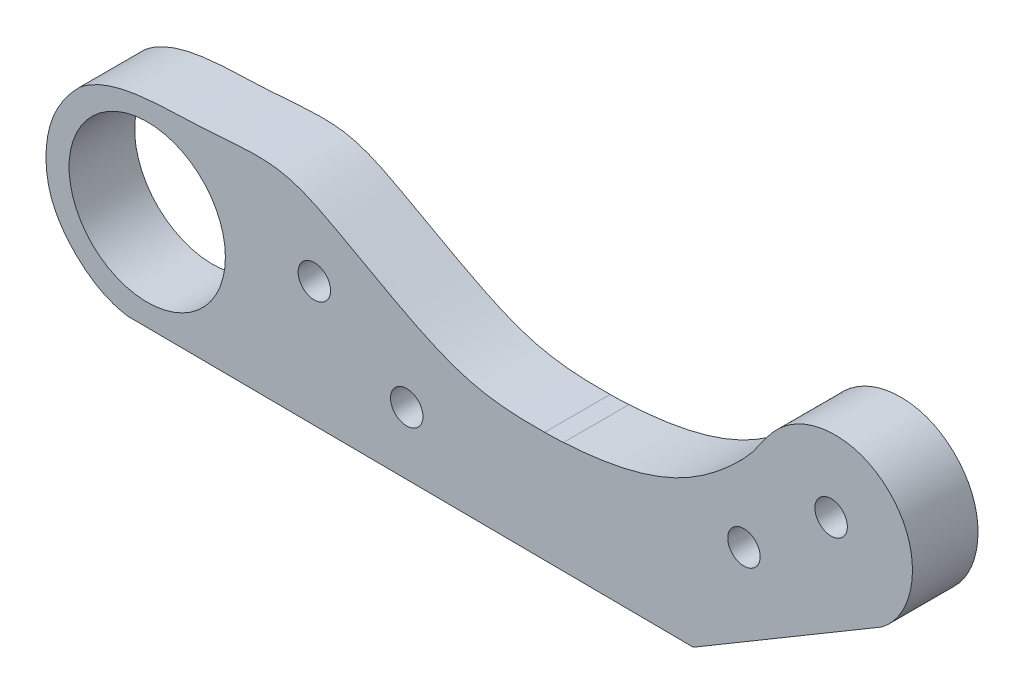
ISO-10303-21;
HEADER;
FILE_DESCRIPTION(('STEP AP214'),'2;1');
FILE_NAME('part.step','',(''),(''),'','','');
FILE_SCHEMA(('AUTOMOTIVE_DESIGN { 1 0 10303 214 1 1 1 1 }'));
ENDSEC;
DATA;
#1=APPLICATION_CONTEXT('core data for automotive mechanical design processes');
#2=APPLICATION_PROTOCOL_DEFINITION('international standard','automotive_design',2000,#1);
#3=PRODUCT_CONTEXT('',#1,'mechanical');
#4=PRODUCT('Part','Part','',(#3));
#5=PRODUCT_RELATED_PRODUCT_CATEGORY('part','',(#4));
#6=PRODUCT_DEFINITION_FORMATION('','',#4);
#7=PRODUCT_DEFINITION_CONTEXT('part definition',#1,'design');
#8=PRODUCT_DEFINITION('design','',#6,#7);
#9=PRODUCT_DEFINITION_SHAPE('','',#8);
#10=(LENGTH_UNIT() NAMED_UNIT(*) SI_UNIT(.MILLI.,.METRE.));
#11=(NAMED_UNIT(*) PLANE_ANGLE_UNIT() SI_UNIT($,.RADIAN.));
#12=(NAMED_UNIT(*) SI_UNIT($,.STERADIAN.) SOLID_ANGLE_UNIT());
#13=UNCERTAINTY_MEASURE_WITH_UNIT(LENGTH_MEASURE(1.E-05),#10,'distance_accuracy_value','');
#14=(GEOMETRIC_REPRESENTATION_CONTEXT(3) GLOBAL_UNCERTAINTY_ASSIGNED_CONTEXT((#13)) GLOBAL_UNIT_ASSIGNED_CONTEXT((#10,
#11,#12)) REPRESENTATION_CONTEXT('',''));
#15=CARTESIAN_POINT('',(0.,0.,0.));
#16=DIRECTION('',(0.,0.,1.));
#17=DIRECTION('',(1.,0.,0.));
#18=AXIS2_PLACEMENT_3D('',#15,#16,#17);
#19=CARTESIAN_POINT('',(-16.3651324524654,27.597237205665,5.05));
#20=DIRECTION('',(-0.510061044769221,0.860138204365398,0.));
#21=DIRECTION('',(-0.860138204365398,-0.510061044769221,0.));
#22=AXIS2_PLACEMENT_3D('',#19,#20,#21);
#23=PLANE('',#22);
#24=DIRECTION('',(0.860138204365398,0.510061044769221,0.));
#25=VECTOR('',#24,1.);
#26=CARTESIAN_POINT('',(-16.3651324524654,27.597237205665,0.));
#27=LINE('',#26,#25);
#28=CARTESIAN_POINT('',(-45.8065173750898,10.1385271089941,0.));
#29=VERTEX_POINT('',#28);
#30=CARTESIAN_POINT('',(-31.2793439312161,18.7531255848201,0.));
#31=VERTEX_POINT('',#30);
#32=EDGE_CURVE('E197',#29,#31,#27,.T.);
#33=ORIENTED_EDGE('',*,*,#32,.T.);
#34=DIRECTION('',(0.,0.,-1.));
#35=VECTOR('',#34,1.);
#36=CARTESIAN_POINT('',(-31.2793439312161,18.7531255848201,5.05));
#37=LINE('',#36,#35);
#38=CARTESIAN_POINT('',(-31.2793439312161,18.7531255848201,5.05));
#39=VERTEX_POINT('',#38);
#40=EDGE_CURVE('E11',#39,#31,#37,.T.);
#41=ORIENTED_EDGE('',*,*,#40,.F.);
#42=DIRECTION('',(0.860138204365398,0.510061044769221,0.));
#43=VECTOR('',#42,1.);
#44=CARTESIAN_POINT('',(-16.3651324524654,27.597237205665,5.05));
#45=LINE('',#44,#43);
#46=CARTESIAN_POINT('',(-45.8065173750898,10.1385271089941,5.05));
#47=VERTEX_POINT('',#46);
#48=EDGE_CURVE('E144',#47,#39,#45,.T.);
#49=ORIENTED_EDGE('',*,*,#48,.F.);
#50=DIRECTION('',(0.,0.,-1.));
#51=VECTOR('',#50,1.);
#52=CARTESIAN_POINT('',(-45.8065173750898,10.1385271089941,5.05));
#53=LINE('',#52,#51);
#54=EDGE_CURVE('E119',#47,#29,#53,.T.);
#55=ORIENTED_EDGE('',*,*,#54,.T.);
#56=EDGE_LOOP('',(#33,#41,#49,#55));
#57=FACE_BOUND('',#56,.T.);
#58=ADVANCED_FACE('F38',(#57),#23,.F.);
#59=CARTESIAN_POINT('',(-31.2793439312161,18.7531255848201,5.05));
#60=CARTESIAN_POINT('',(-29.0980433454653,20.4036510575763,5.05));
#61=CARTESIAN_POINT('',(-27.9050572559335,25.4416248334502,5.05));
#62=CARTESIAN_POINT('',(-32.3003840528742,29.8584116303143,5.05));
#63=CARTESIAN_POINT('',(-36.6905416729498,29.9188634459079,5.05));
#64=CARTESIAN_POINT('',(-39.6148928825368,27.9423766019697,5.05));
#65=CARTESIAN_POINT('',(-41.0324515703013,25.5521004310688,5.05));
#66=CARTESIAN_POINT('',(-43.2846404569285,23.2416386731387,5.05));
#67=CARTESIAN_POINT('',(-48.1487855967706,19.5714869035757,5.05));
#68=CARTESIAN_POINT('',(-55.4824330057748,18.5532288557096,5.05));
#69=CARTESIAN_POINT('',(-63.127762505071,18.8959739607833,5.05));
#70=CARTESIAN_POINT('',(-68.3011033102578,21.4574379799719,5.05));
#71=CARTESIAN_POINT('',(-72.9856177094147,24.0865685804208,5.05));
#72=CARTESIAN_POINT('',(-76.315266746424,25.8751284241934,5.05));
#73=CARTESIAN_POINT('',(-79.7395264028921,26.2367159767452,5.05));
#74=CARTESIAN_POINT('',(-83.2789287024221,25.7950018133173,5.05));
#75=CARTESIAN_POINT('',(-88.2388176781267,25.8484338999151,5.05));
#76=CARTESIAN_POINT('',(-91.6891719871941,24.9989539466543,5.05));
#77=CARTESIAN_POINT('',(-93.08374484262,23.8512105054544,5.05));
#78=B_SPLINE_CURVE_WITH_KNOTS('',3,(#59,#60,#61,#62,#63,#64,#65,#66,#67,#68,#69,#70,#71,#72,#73,
#74,#75,#76,#77),.UNSPECIFIED.,.F.,.F.,(4,1,1,1,1,1,1,1,1,1,1,1,1,1,1,1,4),(0.,
0.102244465290879,0.160154236261766,0.214292787390952,0.256272844332401,0.289149591331498,
0.319658417070902,0.379342085765607,0.518902230963491,0.590344576338759,0.669858141824343,
0.735080639407954,0.798411315906265,0.81036301693689,0.866325433613108,0.934003558728996,1.),.UNSPECIFIED.);
#79=DIRECTION('',(0.,0.,-1.));
#80=VECTOR('',#79,1.);
#81=SURFACE_OF_LINEAR_EXTRUSION('',#78,#80);
#82=CARTESIAN_POINT('',(-31.2793439312161,18.7531255848201,0.));
#83=CARTESIAN_POINT('',(-29.0980433454653,20.4036510575763,0.));
#84=CARTESIAN_POINT('',(-27.9050572559335,25.4416248334502,0.));
#85=CARTESIAN_POINT('',(-32.3003840528742,29.8584116303143,0.));
#86=CARTESIAN_POINT('',(-36.6905416729498,29.9188634459079,0.));
#87=CARTESIAN_POINT('',(-39.6148928825368,27.9423766019697,0.));
#88=CARTESIAN_POINT('',(-41.0324515703013,25.5521004310688,0.));
#89=CARTESIAN_POINT('',(-43.2846404569285,23.2416386731387,0.));
#90=CARTESIAN_POINT('',(-48.1487855967706,19.5714869035757,0.));
#91=CARTESIAN_POINT('',(-55.4824330057748,18.5532288557096,0.));
#92=CARTESIAN_POINT('',(-63.127762505071,18.8959739607833,0.));
#93=CARTESIAN_POINT('',(-68.3011033102578,21.4574379799719,0.));
#94=CARTESIAN_POINT('',(-72.9856177094147,24.0865685804208,0.));
#95=CARTESIAN_POINT('',(-76.315266746424,25.8751284241934,0.));
#96=CARTESIAN_POINT('',(-79.7395264028921,26.2367159767452,0.));
#97=CARTESIAN_POINT('',(-83.2789287024221,25.7950018133173,0.));
#98=CARTESIAN_POINT('',(-88.2388176781267,25.8484338999151,0.));
#99=CARTESIAN_POINT('',(-91.6891719871941,24.9989539466543,0.));
#100=CARTESIAN_POINT('',(-93.08374484262,23.8512105054544,0.));
#101=B_SPLINE_CURVE_WITH_KNOTS('',3,(#82,#83,#84,#85,#86,#87,#88,#89,#90,#91,#92,#93,#94,#95,
#96,#97,#98,#99,#100),.UNSPECIFIED.,.F.,.F.,(4,1,1,1,1,1,1,1,1,1,1,1,1,1,1,1,4),(0.,
0.102244465290879,0.160154236261766,0.214292787390952,0.256272844332401,0.289149591331498,
0.319658417070902,0.379342085765607,0.518902230963491,0.590344576338759,0.669858141824343,
0.735080639407954,0.798411315906265,0.81036301693689,0.866325433613108,0.934003558728996,1.),.UNSPECIFIED.);
#102=CARTESIAN_POINT('',(-55.8031549754553,18.8049533000138,0.));
#103=VERTEX_POINT('',#102);
#104=EDGE_CURVE('E199',#31,#103,#101,.T.);
#105=ORIENTED_EDGE('',*,*,#104,.T.);
#106=DIRECTION('',(0.,0.,-1.));
#107=VECTOR('',#106,1.);
#108=CARTESIAN_POINT('',(-55.8031549754553,18.8049533000138,5.05));
#109=LINE('',#108,#107);
#110=CARTESIAN_POINT('',(-55.8031549754553,18.8049533000138,5.05));
#111=VERTEX_POINT('',#110);
#112=EDGE_CURVE('E47',#111,#103,#109,.T.);
#113=ORIENTED_EDGE('',*,*,#112,.F.);
#114=EDGE_CURVE('E92',#39,#111,#78,.T.);
#115=ORIENTED_EDGE('',*,*,#114,.F.);
#116=ORIENTED_EDGE('',*,*,#40,.T.);
#117=EDGE_LOOP('',(#105,#113,#115,#116));
#118=FACE_BOUND('',#117,.T.);
#119=ADVANCED_FACE('F139',(#118),#81,.F.);
#120=CARTESIAN_POINT('',(-57.2562652498555,37.2981255848201,5.05));
#121=DIRECTION('',(0.,0.,-1.));
#122=DIRECTION('',(1.,0.,0.));
#123=AXIS2_PLACEMENT_3D('',#120,#121,#122);
#124=ELLIPSE('',#123,19.45,18.545);
#125=DIRECTION('',(0.,0.,-1.));
#126=VECTOR('',#125,1.);
#127=SURFACE_OF_LINEAR_EXTRUSION('',#124,#126);
#128=CARTESIAN_POINT('',(-57.2562652498555,37.2981255848201,0.));
#129=DIRECTION('',(0.,0.,-1.));
#130=DIRECTION('',(1.,0.,0.));
#131=AXIS2_PLACEMENT_3D('',#128,#129,#130);
#132=ELLIPSE('',#131,19.45,18.545);
#133=CARTESIAN_POINT('',(-57.2562652498555,18.7531255848201,0.));
#134=VERTEX_POINT('',#133);
#135=EDGE_CURVE('E205',#103,#134,#132,.T.);
#136=ORIENTED_EDGE('',*,*,#135,.T.);
#137=DIRECTION('',(0.,0.,-1.));
#138=VECTOR('',#137,1.);
#139=CARTESIAN_POINT('',(-57.2562652498555,18.7531255848201,5.05));
#140=LINE('',#139,#138);
#141=CARTESIAN_POINT('',(-57.2562652498555,18.7531255848201,5.05));
#142=VERTEX_POINT('',#141);
#143=EDGE_CURVE('E114',#142,#134,#140,.T.);
#144=ORIENTED_EDGE('',*,*,#143,.F.);
#145=EDGE_CURVE('E105',#111,#142,#124,.T.);
#146=ORIENTED_EDGE('',*,*,#145,.F.);
#147=ORIENTED_EDGE('',*,*,#112,.T.);
#148=EDGE_LOOP('',(#136,#144,#146,#147));
#149=FACE_BOUND('',#148,.T.);
#150=ADVANCED_FACE('F138',(#149),#127,.F.);
#151=CARTESIAN_POINT('',(-93.0837448449975,23.8512105031246,0.));
#152=VERTEX_POINT('',#151);
#153=EDGE_CURVE('E113',#134,#152,#101,.T.);
#154=ORIENTED_EDGE('',*,*,#153,.T.);
#155=DIRECTION('',(0.,0.,-1.));
#156=VECTOR('',#155,1.);
#157=CARTESIAN_POINT('',(-93.0837448449975,23.8512105031246,5.05));
#158=LINE('',#157,#156);
#159=CARTESIAN_POINT('',(-93.0837448449975,23.8512105031246,5.05));
#160=VERTEX_POINT('',#159);
#161=EDGE_CURVE('E110',#160,#152,#158,.T.);
#162=ORIENTED_EDGE('',*,*,#161,.F.);
#163=EDGE_CURVE('E99',#142,#160,#78,.T.);
#164=ORIENTED_EDGE('',*,*,#163,.F.);
#165=ORIENTED_EDGE('',*,*,#143,.T.);
#166=EDGE_LOOP('',(#154,#162,#164,#165));
#167=FACE_BOUND('',#166,.T.);
#168=ADVANCED_FACE('F111',(#167),#81,.F.);
#169=CARTESIAN_POINT('',(-45.447999980637,61.2865055482563,5.05));
#170=CARTESIAN_POINT('',(-51.0278893524311,61.1688298874616,5.05));
#171=CARTESIAN_POINT('',(-58.9132499486092,61.1411652448543,5.05));
#172=CARTESIAN_POINT('',(-68.7052418490788,58.8464245541363,5.05));
#173=CARTESIAN_POINT('',(-73.7843710537458,57.3619765706734,5.05));
#174=CARTESIAN_POINT('',(-77.6463785103275,56.2101423912901,5.05));
#175=CARTESIAN_POINT('',(-79.6123367373129,54.116804133715,5.05));
#176=CARTESIAN_POINT('',(-79.7858667435209,51.8488401536115,5.05));
#177=CARTESIAN_POINT('',(-79.5708279834339,50.1208712476038,5.05));
#178=CARTESIAN_POINT('',(-79.8280626135216,48.25629506017,5.05));
#179=CARTESIAN_POINT('',(-80.6296893893469,45.9721549386007,5.05));
#180=CARTESIAN_POINT('',(-81.5739828186396,42.4408487868336,5.05));
#181=CARTESIAN_POINT('',(-82.9109358337757,38.1103981907808,5.05));
#182=CARTESIAN_POINT('',(-84.4849774979321,33.6587041259481,5.05));
#183=CARTESIAN_POINT('',(-86.9306982572566,29.5959467289524,5.05));
#184=CARTESIAN_POINT('',(-89.5527225726976,26.4319697976968,5.05));
#185=CARTESIAN_POINT('',(-93.1345185253551,24.1320199934935,5.05));
#186=CARTESIAN_POINT('',(-95.2267389963488,21.2515944528925,5.05));
#187=CARTESIAN_POINT('',(-95.8242461685684,18.047120823068,5.05));
#188=CARTESIAN_POINT('',(-95.4061739048649,15.1623586750247,5.05));
#189=CARTESIAN_POINT('',(-93.3152451644513,12.1482048617321,5.05));
#190=CARTESIAN_POINT('',(-91.0893353393591,10.6925559491149,5.05));
#191=CARTESIAN_POINT('',(-89.3748982137795,10.4439159602341,5.05));
#192=B_SPLINE_CURVE_WITH_KNOTS('',3,(#169,#170,#171,#172,#173,#174,#175,#176,#177,#178,#179,
#180,#181,#182,#183,#184,#185,#186,#187,#188,#189,#190,#191),.UNSPECIFIED.,.F.,.F.,(4,1,1,1,1,1,
1,1,1,1,1,1,1,1,1,1,1,1,1,1,4),(0.,0.193746416370488,0.269881459228766,0.346531711332351,
0.377650485050324,0.407609602951645,0.438994647159427,0.452450488875014,0.467917052642461,
0.503362358814784,0.536032459638258,0.594231527519269,0.66024296693297,0.69828626256234,
0.757936424635522,0.80003143357371,0.844688231520188,0.876032891927952,0.910905343274308,
0.942275003598052,1.),.UNSPECIFIED.);
#193=DIRECTION('',(0.,0.,-1.));
#194=VECTOR('',#193,1.);
#195=SURFACE_OF_LINEAR_EXTRUSION('',#192,#194);
#196=CARTESIAN_POINT('',(-45.447999980637,61.2865055482563,0.));
#197=CARTESIAN_POINT('',(-51.0278893524311,61.1688298874616,0.));
#198=CARTESIAN_POINT('',(-58.9132499486092,61.1411652448543,0.));
#199=CARTESIAN_POINT('',(-68.7052418490788,58.8464245541363,0.));
#200=CARTESIAN_POINT('',(-73.7843710537458,57.3619765706734,0.));
#201=CARTESIAN_POINT('',(-77.6463785103275,56.2101423912901,0.));
#202=CARTESIAN_POINT('',(-79.6123367373129,54.116804133715,0.));
#203=CARTESIAN_POINT('',(-79.7858667435209,51.8488401536115,0.));
#204=CARTESIAN_POINT('',(-79.5708279834339,50.1208712476038,0.));
#205=CARTESIAN_POINT('',(-79.8280626135216,48.25629506017,0.));
#206=CARTESIAN_POINT('',(-80.6296893893469,45.9721549386007,0.));
#207=CARTESIAN_POINT('',(-81.5739828186396,42.4408487868336,0.));
#208=CARTESIAN_POINT('',(-82.9109358337757,38.1103981907808,0.));
#209=CARTESIAN_POINT('',(-84.4849774979321,33.6587041259481,0.));
#210=CARTESIAN_POINT('',(-86.9306982572566,29.5959467289524,0.));
#211=CARTESIAN_POINT('',(-89.5527225726976,26.4319697976968,0.));
#212=CARTESIAN_POINT('',(-93.1345185253551,24.1320199934935,0.));
#213=CARTESIAN_POINT('',(-95.2267389963488,21.2515944528925,0.));
#214=CARTESIAN_POINT('',(-95.8242461685684,18.047120823068,0.));
#215=CARTESIAN_POINT('',(-95.4061739048649,15.1623586750247,0.));
#216=CARTESIAN_POINT('',(-93.3152451644513,12.1482048617321,0.));
#217=CARTESIAN_POINT('',(-91.0893353393591,10.6925559491149,0.));
#218=CARTESIAN_POINT('',(-89.3748982137795,10.4439159602341,0.));
#219=B_SPLINE_CURVE_WITH_KNOTS('',3,(#196,#197,#198,#199,#200,#201,#202,#203,#204,#205,#206,
#207,#208,#209,#210,#211,#212,#213,#214,#215,#216,#217,#218),.UNSPECIFIED.,.F.,.F.,(4,1,1,1,1,1,
1,1,1,1,1,1,1,1,1,1,1,1,1,1,4),(0.,0.193746416370488,0.269881459228766,0.346531711332351,
0.377650485050324,0.407609602951645,0.438994647159427,0.452450488875014,0.467917052642461,
0.503362358814784,0.536032459638258,0.594231527519269,0.66024296693297,0.69828626256234,
0.757936424635522,0.80003143357371,0.844688231520188,0.876032891927952,0.910905343274308,
0.942275003598052,1.),.UNSPECIFIED.);
#220=CARTESIAN_POINT('',(-89.3748982137796,10.4439159602341,0.));
#221=VERTEX_POINT('',#220);
#222=EDGE_CURVE('E78',#152,#221,#219,.T.);
#223=ORIENTED_EDGE('',*,*,#222,.T.);
#224=DIRECTION('',(0.,0.,-1.));
#225=VECTOR('',#224,1.);
#226=CARTESIAN_POINT('',(-89.3748982137796,10.4439159602341,5.05));
#227=LINE('',#226,#225);
#228=CARTESIAN_POINT('',(-89.3748982137796,10.4439159602341,5.05));
#229=VERTEX_POINT('',#228);
#230=EDGE_CURVE('E115',#229,#221,#227,.T.);
#231=ORIENTED_EDGE('',*,*,#230,.F.);
#232=EDGE_CURVE('E103',#160,#229,#192,.T.);
#233=ORIENTED_EDGE('',*,*,#232,.F.);
#234=ORIENTED_EDGE('',*,*,#161,.T.);
#235=EDGE_LOOP('',(#223,#231,#233,#234));
#236=FACE_BOUND('',#235,.T.);
#237=ADVANCED_FACE('F117',(#236),#195,.F.);
#238=CARTESIAN_POINT('',(-87.8666784734581,18.1393025940135,5.05));
#239=DIRECTION('',(0.,0.,-1.));
#240=DIRECTION('',(-1.,0.,0.));
#241=AXIS2_PLACEMENT_3D('',#238,#239,#240);
#242=CYLINDRICAL_SURFACE('',#241,6.02);
#243=CARTESIAN_POINT('',(-87.8666784734581,18.1393025940135,5.05));
#244=DIRECTION('',(0.,0.,1.));
#245=DIRECTION('',(1.,0.,0.));
#246=AXIS2_PLACEMENT_3D('',#243,#244,#245);
#247=CIRCLE('',#246,6.02);
#248=CARTESIAN_POINT('',(-81.8466784734581,18.1393025940135,5.05));
#249=VERTEX_POINT('',#248);
#250=EDGE_CURVE('E149',#249,#249,#247,.F.);
#251=ORIENTED_EDGE('',*,*,#250,.F.);
#252=EDGE_LOOP('',(#251));
#253=FACE_BOUND('',#252,.T.);
#254=CARTESIAN_POINT('',(-87.8666784734581,18.1393025940135,0.));
#255=DIRECTION('',(0.,0.,1.));
#256=DIRECTION('',(1.,0.,0.));
#257=AXIS2_PLACEMENT_3D('',#254,#255,#256);
#258=CIRCLE('',#257,6.02);
#259=CARTESIAN_POINT('',(-81.8466784734581,18.1393025940135,0.));
#260=VERTEX_POINT('',#259);
#261=EDGE_CURVE('E155',#260,#260,#258,.F.);
#262=ORIENTED_EDGE('',*,*,#261,.T.);
#263=EDGE_LOOP('',(#262));
#264=FACE_BOUND('',#263,.T.);
#265=ADVANCED_FACE('F40',(#253,#264),#242,.F.);
#266=CARTESIAN_POINT('',(0.0688111996184571,9.81696790426816,5.05));
#267=DIRECTION('',(0.00700924256241139,0.99997543495763,0.));
#268=DIRECTION('',(-0.99997543495763,0.00700924256241139,0.));
#269=AXIS2_PLACEMENT_3D('',#266,#267,#268);
#270=PLANE('',#269);
#271=DIRECTION('',(0.99997543495763,-0.00700924256241139,0.));
#272=VECTOR('',#271,1.);
#273=CARTESIAN_POINT('',(0.0688111996184571,9.81696790426816,0.));
#274=LINE('',#273,#272);
#275=EDGE_CURVE('E84',#221,#29,#274,.T.);
#276=ORIENTED_EDGE('',*,*,#275,.T.);
#277=ORIENTED_EDGE('',*,*,#54,.F.);
#278=DIRECTION('',(0.99997543495763,-0.00700924256241139,0.));
#279=VECTOR('',#278,1.);
#280=CARTESIAN_POINT('',(0.0688111996184571,9.81696790426816,5.05));
#281=LINE('',#280,#279);
#282=EDGE_CURVE('E55',#229,#47,#281,.T.);
#283=ORIENTED_EDGE('',*,*,#282,.F.);
#284=ORIENTED_EDGE('',*,*,#230,.T.);
#285=EDGE_LOOP('',(#276,#277,#283,#284));
#286=FACE_BOUND('',#285,.T.);
#287=ADVANCED_FACE('F134',(#286),#270,.F.);
#288=CARTESIAN_POINT('',(0.,0.,5.05));
#289=DIRECTION('',(0.,0.,1.));
#290=DIRECTION('',(1.,0.,0.));
#291=AXIS2_PLACEMENT_3D('',#288,#289,#290);
#292=PLANE('',#291);
#293=CARTESIAN_POINT('',(-67.8766210753395,15.110612873998,5.05));
#294=DIRECTION('',(0.,0.,1.));
#295=DIRECTION('',(1.,0.,0.));
#296=AXIS2_PLACEMENT_3D('',#293,#294,#295);
#297=CIRCLE('',#296,1.24999999999999);
#298=CARTESIAN_POINT('',(-66.6266210753395,15.110612873998,5.05));
#299=VERTEX_POINT('',#298);
#300=EDGE_CURVE('E174',#299,#299,#297,.T.);
#301=ORIENTED_EDGE('',*,*,#300,.F.);
#302=EDGE_LOOP('',(#301));
#303=FACE_BOUND('',#302,.T.);
#304=CARTESIAN_POINT('',(-74.9935608009401,19.9565088478769,5.05));
#305=DIRECTION('',(0.,0.,1.));
#306=DIRECTION('',(1.,0.,0.));
#307=AXIS2_PLACEMENT_3D('',#304,#305,#306);
#308=CIRCLE('',#307,1.24999999999999);
#309=CARTESIAN_POINT('',(-73.7435608009402,19.9565088478769,5.05));
#310=VERTEX_POINT('',#309);
#311=EDGE_CURVE('E168',#310,#310,#308,.T.);
#312=ORIENTED_EDGE('',*,*,#311,.F.);
#313=EDGE_LOOP('',(#312));
#314=FACE_BOUND('',#313,.T.);
#315=CARTESIAN_POINT('',(-41.9031919582391,18.7531255848201,5.05));
#316=DIRECTION('',(0.,0.,1.));
#317=DIRECTION('',(1.,0.,0.));
#318=AXIS2_PLACEMENT_3D('',#315,#316,#317);
#319=CIRCLE('',#318,1.24999999999999);
#320=CARTESIAN_POINT('',(-40.6531919582391,18.7531255848201,5.05));
#321=VERTEX_POINT('',#320);
#322=EDGE_CURVE('E162',#321,#321,#319,.T.);
#323=ORIENTED_EDGE('',*,*,#322,.F.);
#324=EDGE_LOOP('',(#323));
#325=FACE_BOUND('',#324,.T.);
#326=CARTESIAN_POINT('',(-35.1890677699318,24.1135684786121,5.05));
#327=DIRECTION('',(0.,0.,1.));
#328=DIRECTION('',(1.,0.,0.));
#329=AXIS2_PLACEMENT_3D('',#326,#327,#328);
#330=CIRCLE('',#329,1.24999999999999);
#331=CARTESIAN_POINT('',(-33.9390677699318,24.1135684786121,5.05));
#332=VERTEX_POINT('',#331);
#333=EDGE_CURVE('E156',#332,#332,#330,.T.);
#334=ORIENTED_EDGE('',*,*,#333,.F.);
#335=EDGE_LOOP('',(#334));
#336=FACE_BOUND('',#335,.T.);
#337=ORIENTED_EDGE('',*,*,#250,.T.);
#338=EDGE_LOOP('',(#337));
#339=FACE_BOUND('',#338,.T.);
#340=ORIENTED_EDGE('',*,*,#48,.T.);
#341=ORIENTED_EDGE('',*,*,#114,.T.);
#342=ORIENTED_EDGE('',*,*,#145,.T.);
#343=ORIENTED_EDGE('',*,*,#163,.T.);
#344=ORIENTED_EDGE('',*,*,#232,.T.);
#345=ORIENTED_EDGE('',*,*,#282,.T.);
#346=EDGE_LOOP('',(#340,#341,#342,#343,#344,#345));
#347=FACE_BOUND('',#346,.T.);
#348=ADVANCED_FACE('F101',(#303,#314,#325,#336,#339,#347),#292,.T.);
#349=CARTESIAN_POINT('',(0.,0.,0.));
#350=DIRECTION('',(0.,0.,1.));
#351=DIRECTION('',(1.,0.,0.));
#352=AXIS2_PLACEMENT_3D('',#349,#350,#351);
#353=PLANE('',#352);
#354=CARTESIAN_POINT('',(-67.8766210753395,15.110612873998,0.));
#355=DIRECTION('',(0.,0.,1.));
#356=DIRECTION('',(1.,0.,0.));
#357=AXIS2_PLACEMENT_3D('',#354,#355,#356);
#358=CIRCLE('',#357,1.25);
#359=CARTESIAN_POINT('',(-66.6266210753395,15.110612873998,0.));
#360=VERTEX_POINT('',#359);
#361=EDGE_CURVE('E171',#360,#360,#358,.T.);
#362=ORIENTED_EDGE('',*,*,#361,.T.);
#363=EDGE_LOOP('',(#362));
#364=FACE_BOUND('',#363,.T.);
#365=CARTESIAN_POINT('',(-74.9935608009401,19.9565088478769,0.));
#366=DIRECTION('',(0.,0.,1.));
#367=DIRECTION('',(1.,0.,0.));
#368=AXIS2_PLACEMENT_3D('',#365,#366,#367);
#369=CIRCLE('',#368,1.25);
#370=CARTESIAN_POINT('',(-73.7435608009401,19.9565088478769,0.));
#371=VERTEX_POINT('',#370);
#372=EDGE_CURVE('E165',#371,#371,#369,.T.);
#373=ORIENTED_EDGE('',*,*,#372,.T.);
#374=EDGE_LOOP('',(#373));
#375=FACE_BOUND('',#374,.T.);
#376=CARTESIAN_POINT('',(-41.9031919582391,18.7531255848201,0.));
#377=DIRECTION('',(0.,0.,1.));
#378=DIRECTION('',(1.,0.,0.));
#379=AXIS2_PLACEMENT_3D('',#376,#377,#378);
#380=CIRCLE('',#379,1.25);
#381=CARTESIAN_POINT('',(-40.6531919582391,18.7531255848201,0.));
#382=VERTEX_POINT('',#381);
#383=EDGE_CURVE('E159',#382,#382,#380,.T.);
#384=ORIENTED_EDGE('',*,*,#383,.T.);
#385=EDGE_LOOP('',(#384));
#386=FACE_BOUND('',#385,.T.);
#387=CARTESIAN_POINT('',(-35.1890677699318,24.1135684786121,0.));
#388=DIRECTION('',(0.,0.,1.));
#389=DIRECTION('',(1.,0.,0.));
#390=AXIS2_PLACEMENT_3D('',#387,#388,#389);
#391=CIRCLE('',#390,1.25);
#392=CARTESIAN_POINT('',(-33.9390677699318,24.1135684786121,0.));
#393=VERTEX_POINT('',#392);
#394=EDGE_CURVE('E152',#393,#393,#391,.T.);
#395=ORIENTED_EDGE('',*,*,#394,.T.);
#396=EDGE_LOOP('',(#395));
#397=FACE_BOUND('',#396,.T.);
#398=ORIENTED_EDGE('',*,*,#261,.F.);
#399=EDGE_LOOP('',(#398));
#400=FACE_BOUND('',#399,.T.);
#401=ORIENTED_EDGE('',*,*,#32,.F.);
#402=ORIENTED_EDGE('',*,*,#275,.F.);
#403=ORIENTED_EDGE('',*,*,#222,.F.);
#404=ORIENTED_EDGE('',*,*,#153,.F.);
#405=ORIENTED_EDGE('',*,*,#135,.F.);
#406=ORIENTED_EDGE('',*,*,#104,.F.);
#407=EDGE_LOOP('',(#401,#402,#403,#404,#405,#406));
#408=FACE_BOUND('',#407,.T.);
#409=ADVANCED_FACE('F182',(#364,#375,#386,#397,#400,#408),#353,.F.);
#410=CARTESIAN_POINT('',(-35.1890677699318,24.1135684786121,5.05));
#411=DIRECTION('',(0.,0.,1.));
#412=DIRECTION('',(1.,0.,0.));
#413=AXIS2_PLACEMENT_3D('',#410,#411,#412);
#414=CYLINDRICAL_SURFACE('',#413,1.24999999999999);
#415=ORIENTED_EDGE('',*,*,#394,.F.);
#416=EDGE_LOOP('',(#415));
#417=FACE_BOUND('',#416,.T.);
#418=ORIENTED_EDGE('',*,*,#333,.T.);
#419=EDGE_LOOP('',(#418));
#420=FACE_BOUND('',#419,.T.);
#421=ADVANCED_FACE('F272',(#417,#420),#414,.F.);
#422=CARTESIAN_POINT('',(-41.9031919582391,18.7531255848201,5.05));
#423=DIRECTION('',(0.,0.,1.));
#424=DIRECTION('',(1.,0.,0.));
#425=AXIS2_PLACEMENT_3D('',#422,#423,#424);
#426=CYLINDRICAL_SURFACE('',#425,1.24999999999999);
#427=ORIENTED_EDGE('',*,*,#383,.F.);
#428=EDGE_LOOP('',(#427));
#429=FACE_BOUND('',#428,.T.);
#430=ORIENTED_EDGE('',*,*,#322,.T.);
#431=EDGE_LOOP('',(#430));
#432=FACE_BOUND('',#431,.T.);
#433=ADVANCED_FACE('F282',(#429,#432),#426,.F.);
#434=CARTESIAN_POINT('',(-74.9935608009401,19.9565088478769,5.05));
#435=DIRECTION('',(0.,0.,1.));
#436=DIRECTION('',(1.,0.,0.));
#437=AXIS2_PLACEMENT_3D('',#434,#435,#436);
#438=CYLINDRICAL_SURFACE('',#437,1.24999999999999);
#439=ORIENTED_EDGE('',*,*,#372,.F.);
#440=EDGE_LOOP('',(#439));
#441=FACE_BOUND('',#440,.T.);
#442=ORIENTED_EDGE('',*,*,#311,.T.);
#443=EDGE_LOOP('',(#442));
#444=FACE_BOUND('',#443,.T.);
#445=ADVANCED_FACE('F293',(#441,#444),#438,.F.);
#446=CARTESIAN_POINT('',(-67.8766210753395,15.110612873998,5.05));
#447=DIRECTION('',(0.,0.,1.));
#448=DIRECTION('',(1.,0.,0.));
#449=AXIS2_PLACEMENT_3D('',#446,#447,#448);
#450=CYLINDRICAL_SURFACE('',#449,1.24999999999999);
#451=ORIENTED_EDGE('',*,*,#361,.F.);
#452=EDGE_LOOP('',(#451));
#453=FACE_BOUND('',#452,.T.);
#454=ORIENTED_EDGE('',*,*,#300,.T.);
#455=EDGE_LOOP('',(#454));
#456=FACE_BOUND('',#455,.T.);
#457=ADVANCED_FACE('F178',(#453,#456),#450,.F.);
#458=CLOSED_SHELL('',(#58,#119,#150,#168,#237,#265,#287,#348,#409,#421,#433,#445,#457));
#459=MANIFOLD_SOLID_BREP('B2',#458);
#460=ADVANCED_BREP_SHAPE_REPRESENTATION('',(#18,#459),#14);
#461=SHAPE_DEFINITION_REPRESENTATION(#9,#460);
ENDSEC;
END-ISO-10303-21;
